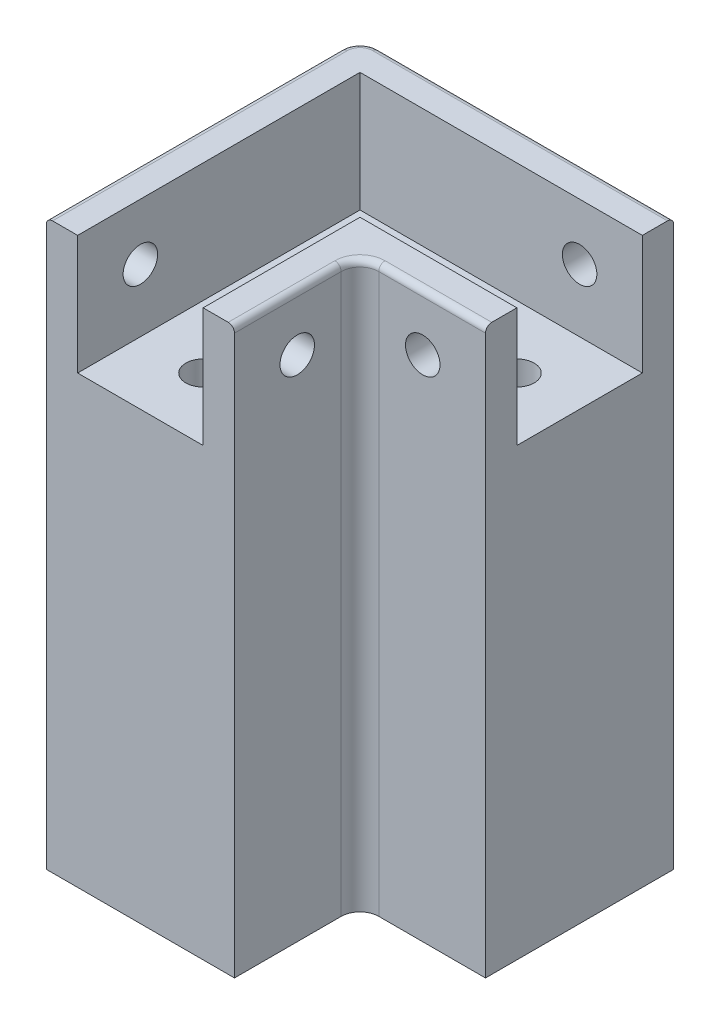
ISO-10303-21;
HEADER;
FILE_DESCRIPTION(('STEP AP214'),'2;1');
FILE_NAME('part.step','',(''),(''),'','','');
FILE_SCHEMA(('AUTOMOTIVE_DESIGN { 1 0 10303 214 1 1 1 1 }'));
ENDSEC;
DATA;
#1=APPLICATION_CONTEXT('core data for automotive mechanical design processes');
#2=APPLICATION_PROTOCOL_DEFINITION('international standard','automotive_design',2000,#1);
#3=PRODUCT_CONTEXT('',#1,'mechanical');
#4=PRODUCT('Part','Part','',(#3));
#5=PRODUCT_RELATED_PRODUCT_CATEGORY('part','',(#4));
#6=PRODUCT_DEFINITION_FORMATION('','',#4);
#7=PRODUCT_DEFINITION_CONTEXT('part definition',#1,'design');
#8=PRODUCT_DEFINITION('design','',#6,#7);
#9=PRODUCT_DEFINITION_SHAPE('','',#8);
#10=(LENGTH_UNIT() NAMED_UNIT(*) SI_UNIT(.MILLI.,.METRE.));
#11=(NAMED_UNIT(*) PLANE_ANGLE_UNIT() SI_UNIT($,.RADIAN.));
#12=(NAMED_UNIT(*) SI_UNIT($,.STERADIAN.) SOLID_ANGLE_UNIT());
#13=UNCERTAINTY_MEASURE_WITH_UNIT(LENGTH_MEASURE(1.E-05),#10,'distance_accuracy_value','');
#14=(GEOMETRIC_REPRESENTATION_CONTEXT(3) GLOBAL_UNCERTAINTY_ASSIGNED_CONTEXT((#13)) GLOBAL_UNIT_ASSIGNED_CONTEXT((#10,
#11,#12)) REPRESENTATION_CONTEXT('',''));
#15=CARTESIAN_POINT('',(0.,0.,0.));
#16=DIRECTION('',(0.,0.,1.));
#17=DIRECTION('',(1.,0.,0.));
#18=AXIS2_PLACEMENT_3D('',#15,#16,#17);
#19=CARTESIAN_POINT('',(0.,90.,0.));
#20=DIRECTION('',(0.,-1.,0.));
#21=DIRECTION('',(0.,0.,-1.));
#22=AXIS2_PLACEMENT_3D('',#19,#20,#21);
#23=PLANE('',#22);
#24=DIRECTION('',(0.,0.,-1.));
#25=VECTOR('',#24,1.);
#26=CARTESIAN_POINT('',(50.,90.,0.));
#27=LINE('',#26,#25);
#28=CARTESIAN_POINT('',(50.,90.,-45.));
#29=VERTEX_POINT('',#28);
#30=CARTESIAN_POINT('',(50.,90.,-49.));
#31=VERTEX_POINT('',#30);
#32=EDGE_CURVE('E343',#29,#31,#27,.T.);
#33=ORIENTED_EDGE('',*,*,#32,.T.);
#34=DIRECTION('',(-1.,0.,0.));
#35=VECTOR('',#34,1.);
#36=CARTESIAN_POINT('',(0.,90.,-49.));
#37=LINE('',#36,#35);
#38=CARTESIAN_POINT('',(3.,90.,-49.));
#39=VERTEX_POINT('',#38);
#40=EDGE_CURVE('E295',#31,#39,#37,.T.);
#41=ORIENTED_EDGE('',*,*,#40,.T.);
#42=CARTESIAN_POINT('',(3.,90.,-47.));
#43=DIRECTION('',(0.,-1.,0.));
#44=DIRECTION('',(0.,0.,-1.));
#45=AXIS2_PLACEMENT_3D('',#42,#43,#44);
#46=CIRCLE('',#45,2.);
#47=CARTESIAN_POINT('',(1.,90.,-47.));
#48=VERTEX_POINT('',#47);
#49=EDGE_CURVE('E292',#39,#48,#46,.F.);
#50=ORIENTED_EDGE('',*,*,#49,.T.);
#51=DIRECTION('',(0.,0.,1.));
#52=VECTOR('',#51,1.);
#53=CARTESIAN_POINT('',(1.,90.,0.));
#54=LINE('',#53,#52);
#55=CARTESIAN_POINT('',(0.999999999999999,90.,0.));
#56=VERTEX_POINT('',#55);
#57=EDGE_CURVE('E289',#48,#56,#54,.T.);
#58=ORIENTED_EDGE('',*,*,#57,.T.);
#59=DIRECTION('',(1.,0.,0.));
#60=VECTOR('',#59,1.);
#61=CARTESIAN_POINT('',(0.,90.,0.));
#62=LINE('',#61,#60);
#63=CARTESIAN_POINT('',(5.,90.,0.));
#64=VERTEX_POINT('',#63);
#65=EDGE_CURVE('E336',#56,#64,#62,.T.);
#66=ORIENTED_EDGE('',*,*,#65,.T.);
#67=DIRECTION('',(0.,0.,1.));
#68=VECTOR('',#67,1.);
#69=CARTESIAN_POINT('',(5.,90.,0.));
#70=LINE('',#69,#68);
#71=CARTESIAN_POINT('',(5.,90.,-45.));
#72=VERTEX_POINT('',#71);
#73=EDGE_CURVE('E395',#72,#64,#70,.T.);
#74=ORIENTED_EDGE('',*,*,#73,.F.);
#75=DIRECTION('',(-1.,0.,0.));
#76=VECTOR('',#75,1.);
#77=CARTESIAN_POINT('',(5.,90.,-45.));
#78=LINE('',#77,#76);
#79=EDGE_CURVE('E367',#29,#72,#78,.T.);
#80=ORIENTED_EDGE('',*,*,#79,.F.);
#81=EDGE_LOOP('',(#33,#41,#50,#58,#66,#74,#80));
#82=FACE_BOUND('',#81,.T.);
#83=ADVANCED_FACE('F45',(#82),#23,.F.);
#84=CARTESIAN_POINT('',(0.,90.,0.));
#85=DIRECTION('',(1.,0.,0.));
#86=DIRECTION('',(0.,0.,-1.));
#87=AXIS2_PLACEMENT_3D('',#84,#85,#86);
#88=PLANE('',#87);
#89=CARTESIAN_POINT('',(0.,81.,-10.));
#90=DIRECTION('',(-1.,0.,0.));
#91=DIRECTION('',(0.,0.,1.));
#92=AXIS2_PLACEMENT_3D('',#89,#90,#91);
#93=CIRCLE('',#92,2.75);
#94=CARTESIAN_POINT('',(0.,81.,-7.25));
#95=VERTEX_POINT('',#94);
#96=EDGE_CURVE('E245',#95,#95,#93,.T.);
#97=ORIENTED_EDGE('',*,*,#96,.F.);
#98=EDGE_LOOP('',(#97));
#99=FACE_BOUND('',#98,.T.);
#100=DIRECTION('',(0.,-1.,0.));
#101=VECTOR('',#100,1.);
#102=CARTESIAN_POINT('',(0.,90.,0.));
#103=LINE('',#102,#101);
#104=CARTESIAN_POINT('',(0.,89.,0.));
#105=VERTEX_POINT('',#104);
#106=CARTESIAN_POINT('',(0.,0.,0.));
#107=VERTEX_POINT('',#106);
#108=EDGE_CURVE('E221',#105,#107,#103,.T.);
#109=ORIENTED_EDGE('',*,*,#108,.F.);
#110=DIRECTION('',(0.,0.,1.));
#111=VECTOR('',#110,1.);
#112=CARTESIAN_POINT('',(0.,89.,0.));
#113=LINE('',#112,#111);
#114=CARTESIAN_POINT('',(0.,89.,-47.));
#115=VERTEX_POINT('',#114);
#116=EDGE_CURVE('E12',#105,#115,#113,.F.);
#117=ORIENTED_EDGE('',*,*,#116,.T.);
#118=DIRECTION('',(0.,-1.,0.));
#119=VECTOR('',#118,1.);
#120=CARTESIAN_POINT('',(0.,90.,-47.));
#121=LINE('',#120,#119);
#122=CARTESIAN_POINT('',(0.,0.,-47.));
#123=VERTEX_POINT('',#122);
#124=EDGE_CURVE('E256',#115,#123,#121,.T.);
#125=ORIENTED_EDGE('',*,*,#124,.T.);
#126=DIRECTION('',(0.,0.,1.));
#127=VECTOR('',#126,1.);
#128=CARTESIAN_POINT('',(0.,0.,0.));
#129=LINE('',#128,#127);
#130=EDGE_CURVE('E214',#123,#107,#129,.T.);
#131=ORIENTED_EDGE('',*,*,#130,.T.);
#132=EDGE_LOOP('',(#109,#117,#125,#131));
#133=FACE_BOUND('',#132,.T.);
#134=ADVANCED_FACE('F446',(#99,#133),#88,.F.);
#135=CARTESIAN_POINT('',(0.,90.,0.));
#136=DIRECTION('',(0.,0.,-1.));
#137=DIRECTION('',(-1.,0.,0.));
#138=AXIS2_PLACEMENT_3D('',#135,#136,#137);
#139=PLANE('',#138);
#140=DIRECTION('',(0.,1.,0.));
#141=VECTOR('',#140,1.);
#142=CARTESIAN_POINT('',(29.9967469095641,0.,0.));
#143=LINE('',#142,#141);
#144=CARTESIAN_POINT('',(29.9967469095641,0.,0.));
#145=VERTEX_POINT('',#144);
#146=CARTESIAN_POINT('',(29.9967469095641,89.,0.));
#147=VERTEX_POINT('',#146);
#148=EDGE_CURVE('E200',#145,#147,#143,.T.);
#149=ORIENTED_EDGE('',*,*,#148,.T.);
#150=CARTESIAN_POINT('',(28.9967469095641,89.,0.));
#151=DIRECTION('',(0.,0.,-1.));
#152=DIRECTION('',(-1.,0.,0.));
#153=AXIS2_PLACEMENT_3D('',#150,#151,#152);
#154=CIRCLE('',#153,1.);
#155=CARTESIAN_POINT('',(28.9967469095641,90.,0.));
#156=VERTEX_POINT('',#155);
#157=EDGE_CURVE('E55',#147,#156,#154,.F.);
#158=ORIENTED_EDGE('',*,*,#157,.T.);
#159=CARTESIAN_POINT('',(25.,90.,0.));
#160=VERTEX_POINT('',#159);
#161=EDGE_CURVE('E211',#160,#156,#62,.T.);
#162=ORIENTED_EDGE('',*,*,#161,.F.);
#163=DIRECTION('',(0.,1.,0.));
#164=VECTOR('',#163,1.);
#165=CARTESIAN_POINT('',(25.,71.,0.));
#166=LINE('',#165,#164);
#167=CARTESIAN_POINT('',(25.,71.,0.));
#168=VERTEX_POINT('',#167);
#169=EDGE_CURVE('E375',#168,#160,#166,.T.);
#170=ORIENTED_EDGE('',*,*,#169,.F.);
#171=DIRECTION('',(1.,0.,0.));
#172=VECTOR('',#171,1.);
#173=CARTESIAN_POINT('',(5.,71.,0.));
#174=LINE('',#173,#172);
#175=CARTESIAN_POINT('',(5.,71.,0.));
#176=VERTEX_POINT('',#175);
#177=EDGE_CURVE('E410',#176,#168,#174,.T.);
#178=ORIENTED_EDGE('',*,*,#177,.F.);
#179=DIRECTION('',(0.,1.,0.));
#180=VECTOR('',#179,1.);
#181=CARTESIAN_POINT('',(5.,71.,0.));
#182=LINE('',#181,#180);
#183=EDGE_CURVE('E341',#176,#64,#182,.T.);
#184=ORIENTED_EDGE('',*,*,#183,.T.);
#185=ORIENTED_EDGE('',*,*,#65,.F.);
#186=CARTESIAN_POINT('',(1.,89.,0.));
#187=DIRECTION('',(0.,0.,-1.));
#188=DIRECTION('',(-1.,0.,0.));
#189=AXIS2_PLACEMENT_3D('',#186,#187,#188);
#190=CIRCLE('',#189,1.);
#191=EDGE_CURVE('E63',#56,#105,#190,.F.);
#192=ORIENTED_EDGE('',*,*,#191,.T.);
#193=ORIENTED_EDGE('',*,*,#108,.T.);
#194=DIRECTION('',(1.,0.,0.));
#195=VECTOR('',#194,1.);
#196=CARTESIAN_POINT('',(0.,0.,0.));
#197=LINE('',#196,#195);
#198=EDGE_CURVE('E207',#107,#145,#197,.T.);
#199=ORIENTED_EDGE('',*,*,#198,.T.);
#200=EDGE_LOOP('',(#149,#158,#162,#170,#178,#184,#185,#192,#193,#199));
#201=FACE_BOUND('',#200,.T.);
#202=ADVANCED_FACE('F339',(#201),#139,.F.);
#203=CARTESIAN_POINT('',(50.,90.,0.));
#204=DIRECTION('',(-1.,0.,0.));
#205=DIRECTION('',(0.,0.,1.));
#206=AXIS2_PLACEMENT_3D('',#203,#204,#205);
#207=PLANE('',#206);
#208=CARTESIAN_POINT('',(50.,90.,-21.));
#209=VERTEX_POINT('',#208);
#210=CARTESIAN_POINT('',(50.,90.,-25.));
#211=VERTEX_POINT('',#210);
#212=EDGE_CURVE('E222',#209,#211,#27,.T.);
#213=ORIENTED_EDGE('',*,*,#212,.F.);
#214=CARTESIAN_POINT('',(50.,89.,-21.));
#215=DIRECTION('',(-1.,0.,0.));
#216=DIRECTION('',(0.,0.,1.));
#217=AXIS2_PLACEMENT_3D('',#214,#215,#216);
#218=CIRCLE('',#217,1.);
#219=CARTESIAN_POINT('',(50.,89.,-20.));
#220=VERTEX_POINT('',#219);
#221=EDGE_CURVE('E198',#209,#220,#218,.F.);
#222=ORIENTED_EDGE('',*,*,#221,.T.);
#223=DIRECTION('',(0.,1.,0.));
#224=VECTOR('',#223,1.);
#225=CARTESIAN_POINT('',(50.,0.,-20.));
#226=LINE('',#225,#224);
#227=CARTESIAN_POINT('',(50.,0.,-20.));
#228=VERTEX_POINT('',#227);
#229=EDGE_CURVE('E179',#228,#220,#226,.T.);
#230=ORIENTED_EDGE('',*,*,#229,.F.);
#231=DIRECTION('',(0.,0.,-1.));
#232=VECTOR('',#231,1.);
#233=CARTESIAN_POINT('',(50.,0.,0.));
#234=LINE('',#233,#232);
#235=CARTESIAN_POINT('',(50.,0.,-50.));
#236=VERTEX_POINT('',#235);
#237=EDGE_CURVE('E195',#228,#236,#234,.T.);
#238=ORIENTED_EDGE('',*,*,#237,.T.);
#239=DIRECTION('',(0.,-1.,0.));
#240=VECTOR('',#239,1.);
#241=CARTESIAN_POINT('',(50.,90.,-50.));
#242=LINE('',#241,#240);
#243=CARTESIAN_POINT('',(50.,89.,-50.));
#244=VERTEX_POINT('',#243);
#245=EDGE_CURVE('E218',#244,#236,#242,.T.);
#246=ORIENTED_EDGE('',*,*,#245,.F.);
#247=CARTESIAN_POINT('',(50.,89.,-49.));
#248=DIRECTION('',(-1.,0.,0.));
#249=DIRECTION('',(0.,0.,1.));
#250=AXIS2_PLACEMENT_3D('',#247,#248,#249);
#251=CIRCLE('',#250,1.);
#252=EDGE_CURVE('E281',#244,#31,#251,.F.);
#253=ORIENTED_EDGE('',*,*,#252,.T.);
#254=ORIENTED_EDGE('',*,*,#32,.F.);
#255=DIRECTION('',(0.,1.,0.));
#256=VECTOR('',#255,1.);
#257=CARTESIAN_POINT('',(50.,71.,-45.));
#258=LINE('',#257,#256);
#259=CARTESIAN_POINT('',(50.,71.,-45.));
#260=VERTEX_POINT('',#259);
#261=EDGE_CURVE('E358',#260,#29,#258,.T.);
#262=ORIENTED_EDGE('',*,*,#261,.F.);
#263=DIRECTION('',(0.,0.,-1.));
#264=VECTOR('',#263,1.);
#265=CARTESIAN_POINT('',(50.,71.,-45.));
#266=LINE('',#265,#264);
#267=CARTESIAN_POINT('',(50.,71.,-25.));
#268=VERTEX_POINT('',#267);
#269=EDGE_CURVE('E385',#268,#260,#266,.T.);
#270=ORIENTED_EDGE('',*,*,#269,.F.);
#271=DIRECTION('',(0.,1.,0.));
#272=VECTOR('',#271,1.);
#273=CARTESIAN_POINT('',(50.,71.,-25.));
#274=LINE('',#273,#272);
#275=EDGE_CURVE('E364',#268,#211,#274,.T.);
#276=ORIENTED_EDGE('',*,*,#275,.T.);
#277=EDGE_LOOP('',(#213,#222,#230,#238,#246,#253,#254,#262,#270,#276));
#278=FACE_BOUND('',#277,.T.);
#279=ADVANCED_FACE('F193',(#278),#207,.F.);
#280=CARTESIAN_POINT('',(0.,90.,-50.));
#281=DIRECTION('',(0.,0.,1.));
#282=DIRECTION('',(1.,0.,0.));
#283=AXIS2_PLACEMENT_3D('',#280,#281,#282);
#284=PLANE('',#283);
#285=CARTESIAN_POINT('',(40.,81.,-50.));
#286=DIRECTION('',(0.,0.,-1.));
#287=DIRECTION('',(-1.,0.,0.));
#288=AXIS2_PLACEMENT_3D('',#285,#286,#287);
#289=CIRCLE('',#288,2.75);
#290=CARTESIAN_POINT('',(37.25,81.,-50.));
#291=VERTEX_POINT('',#290);
#292=EDGE_CURVE('E251',#291,#291,#289,.T.);
#293=ORIENTED_EDGE('',*,*,#292,.F.);
#294=EDGE_LOOP('',(#293));
#295=FACE_BOUND('',#294,.T.);
#296=DIRECTION('',(0.,-1.,0.));
#297=VECTOR('',#296,1.);
#298=CARTESIAN_POINT('',(3.,90.,-50.));
#299=LINE('',#298,#297);
#300=CARTESIAN_POINT('',(3.,0.,-50.));
#301=VERTEX_POINT('',#300);
#302=CARTESIAN_POINT('',(3.,89.,-50.));
#303=VERTEX_POINT('',#302);
#304=EDGE_CURVE('E262',#301,#303,#299,.F.);
#305=ORIENTED_EDGE('',*,*,#304,.T.);
#306=DIRECTION('',(-1.,0.,0.));
#307=VECTOR('',#306,1.);
#308=CARTESIAN_POINT('',(0.,89.,-50.));
#309=LINE('',#308,#307);
#310=EDGE_CURVE('E299',#303,#244,#309,.F.);
#311=ORIENTED_EDGE('',*,*,#310,.T.);
#312=ORIENTED_EDGE('',*,*,#245,.T.);
#313=DIRECTION('',(-1.,0.,0.));
#314=VECTOR('',#313,1.);
#315=CARTESIAN_POINT('',(0.,0.,-50.));
#316=LINE('',#315,#314);
#317=EDGE_CURVE('E205',#236,#301,#316,.T.);
#318=ORIENTED_EDGE('',*,*,#317,.T.);
#319=EDGE_LOOP('',(#305,#311,#312,#318));
#320=FACE_BOUND('',#319,.T.);
#321=ADVANCED_FACE('F453',(#295,#320),#284,.F.);
#322=CARTESIAN_POINT('',(32.9967469095641,90.,-17.));
#323=DIRECTION('',(0.,-1.,0.));
#324=DIRECTION('',(0.,0.,-1.));
#325=AXIS2_PLACEMENT_3D('',#322,#323,#324);
#326=CIRCLE('',#325,4.);
#327=CARTESIAN_POINT('',(28.9967469095641,90.,-17.));
#328=VERTEX_POINT('',#327);
#329=CARTESIAN_POINT('',(32.9967469095641,90.,-21.));
#330=VERTEX_POINT('',#329);
#331=EDGE_CURVE('E275',#328,#330,#326,.T.);
#332=ORIENTED_EDGE('',*,*,#331,.T.);
#333=DIRECTION('',(-1.,0.,0.));
#334=VECTOR('',#333,1.);
#335=CARTESIAN_POINT('',(0.,90.,-21.));
#336=LINE('',#335,#334);
#337=EDGE_CURVE('E278',#330,#209,#336,.F.);
#338=ORIENTED_EDGE('',*,*,#337,.T.);
#339=ORIENTED_EDGE('',*,*,#212,.T.);
#340=DIRECTION('',(1.,0.,0.));
#341=VECTOR('',#340,1.);
#342=CARTESIAN_POINT('',(25.,90.,-25.));
#343=LINE('',#342,#341);
#344=CARTESIAN_POINT('',(25.,90.,-25.));
#345=VERTEX_POINT('',#344);
#346=EDGE_CURVE('E400',#345,#211,#343,.T.);
#347=ORIENTED_EDGE('',*,*,#346,.F.);
#348=DIRECTION('',(0.,0.,-1.));
#349=VECTOR('',#348,1.);
#350=CARTESIAN_POINT('',(25.,90.,0.));
#351=LINE('',#350,#349);
#352=EDGE_CURVE('E398',#160,#345,#351,.T.);
#353=ORIENTED_EDGE('',*,*,#352,.F.);
#354=ORIENTED_EDGE('',*,*,#161,.T.);
#355=DIRECTION('',(0.,0.,1.));
#356=VECTOR('',#355,1.);
#357=CARTESIAN_POINT('',(28.9967469095641,90.,0.));
#358=LINE('',#357,#356);
#359=EDGE_CURVE('E272',#156,#328,#358,.F.);
#360=ORIENTED_EDGE('',*,*,#359,.T.);
#361=EDGE_LOOP('',(#332,#338,#339,#347,#353,#354,#360));
#362=FACE_BOUND('',#361,.T.);
#363=ADVANCED_FACE('F439',(#362),#23,.F.);
#364=CARTESIAN_POINT('',(0.,0.,0.));
#365=DIRECTION('',(0.,-1.,0.));
#366=DIRECTION('',(0.,0.,-1.));
#367=AXIS2_PLACEMENT_3D('',#364,#365,#366);
#368=PLANE('',#367);
#369=CARTESIAN_POINT('',(14.998373454782,0.,-10.));
#370=DIRECTION('',(0.,-1.,0.));
#371=DIRECTION('',(0.,0.,-1.));
#372=AXIS2_PLACEMENT_3D('',#369,#370,#371);
#373=CIRCLE('',#372,6.);
#374=CARTESIAN_POINT('',(14.998373454782,0.,-16.));
#375=VERTEX_POINT('',#374);
#376=EDGE_CURVE('E759',#375,#375,#373,.T.);
#377=ORIENTED_EDGE('',*,*,#376,.F.);
#378=EDGE_LOOP('',(#377));
#379=FACE_BOUND('',#378,.T.);
#380=CARTESIAN_POINT('',(40.,0.,-35.));
#381=DIRECTION('',(0.,-1.,0.));
#382=DIRECTION('',(0.,0.,-1.));
#383=AXIS2_PLACEMENT_3D('',#380,#381,#382);
#384=CIRCLE('',#383,6.);
#385=CARTESIAN_POINT('',(40.,0.,-41.));
#386=VERTEX_POINT('',#385);
#387=EDGE_CURVE('E767',#386,#386,#384,.T.);
#388=ORIENTED_EDGE('',*,*,#387,.F.);
#389=EDGE_LOOP('',(#388));
#390=FACE_BOUND('',#389,.T.);
#391=CARTESIAN_POINT('',(14.9983734547821,0.,-35.));
#392=DIRECTION('',(0.,-1.,0.));
#393=DIRECTION('',(0.,0.,-1.));
#394=AXIS2_PLACEMENT_3D('',#391,#392,#393);
#395=CIRCLE('',#394,6.);
#396=CARTESIAN_POINT('',(14.9983734547821,0.,-41.));
#397=VERTEX_POINT('',#396);
#398=EDGE_CURVE('E239',#397,#397,#395,.T.);
#399=ORIENTED_EDGE('',*,*,#398,.F.);
#400=EDGE_LOOP('',(#399));
#401=FACE_BOUND('',#400,.T.);
#402=ORIENTED_EDGE('',*,*,#130,.F.);
#403=CARTESIAN_POINT('',(3.,0.,-47.));
#404=DIRECTION('',(0.,-1.,0.));
#405=DIRECTION('',(0.,0.,-1.));
#406=AXIS2_PLACEMENT_3D('',#403,#404,#405);
#407=CIRCLE('',#406,3.);
#408=EDGE_CURVE('E259',#123,#301,#407,.T.);
#409=ORIENTED_EDGE('',*,*,#408,.T.);
#410=ORIENTED_EDGE('',*,*,#317,.F.);
#411=ORIENTED_EDGE('',*,*,#237,.F.);
#412=DIRECTION('',(-1.,0.,0.));
#413=VECTOR('',#412,1.);
#414=CARTESIAN_POINT('',(50.,0.,-20.));
#415=LINE('',#414,#413);
#416=CARTESIAN_POINT('',(32.9967469095641,0.,-20.));
#417=VERTEX_POINT('',#416);
#418=EDGE_CURVE('E175',#228,#417,#415,.T.);
#419=ORIENTED_EDGE('',*,*,#418,.T.);
#420=CARTESIAN_POINT('',(32.9967469095641,0.,-17.));
#421=DIRECTION('',(0.,-1.,0.));
#422=DIRECTION('',(0.,0.,-1.));
#423=AXIS2_PLACEMENT_3D('',#420,#421,#422);
#424=CIRCLE('',#423,3.);
#425=CARTESIAN_POINT('',(29.9967469095641,0.,-17.));
#426=VERTEX_POINT('',#425);
#427=EDGE_CURVE('E266',#417,#426,#424,.F.);
#428=ORIENTED_EDGE('',*,*,#427,.T.);
#429=DIRECTION('',(0.,0.,1.));
#430=VECTOR('',#429,1.);
#431=CARTESIAN_POINT('',(29.9967469095641,0.,0.));
#432=LINE('',#431,#430);
#433=EDGE_CURVE('E187',#426,#145,#432,.T.);
#434=ORIENTED_EDGE('',*,*,#433,.T.);
#435=ORIENTED_EDGE('',*,*,#198,.F.);
#436=EDGE_LOOP('',(#402,#409,#410,#411,#419,#428,#434,#435));
#437=FACE_BOUND('',#436,.T.);
#438=ADVANCED_FACE('F203',(#379,#390,#401,#437),#368,.T.);
#439=CARTESIAN_POINT('',(5.,71.,0.));
#440=DIRECTION('',(-1.,0.,0.));
#441=DIRECTION('',(0.,0.,1.));
#442=AXIS2_PLACEMENT_3D('',#439,#440,#441);
#443=PLANE('',#442);
#444=CARTESIAN_POINT('',(5.,81.,-10.));
#445=DIRECTION('',(-1.,0.,0.));
#446=DIRECTION('',(0.,0.,1.));
#447=AXIS2_PLACEMENT_3D('',#444,#445,#446);
#448=CIRCLE('',#447,2.75);
#449=CARTESIAN_POINT('',(5.,81.,-7.25));
#450=VERTEX_POINT('',#449);
#451=EDGE_CURVE('E741',#450,#450,#448,.T.);
#452=ORIENTED_EDGE('',*,*,#451,.T.);
#453=EDGE_LOOP('',(#452));
#454=FACE_BOUND('',#453,.T.);
#455=ORIENTED_EDGE('',*,*,#73,.T.);
#456=ORIENTED_EDGE('',*,*,#183,.F.);
#457=DIRECTION('',(0.,0.,1.));
#458=VECTOR('',#457,1.);
#459=CARTESIAN_POINT('',(5.,71.,0.));
#460=LINE('',#459,#458);
#461=CARTESIAN_POINT('',(5.,71.,-45.));
#462=VERTEX_POINT('',#461);
#463=EDGE_CURVE('E406',#462,#176,#460,.T.);
#464=ORIENTED_EDGE('',*,*,#463,.F.);
#465=DIRECTION('',(0.,1.,0.));
#466=VECTOR('',#465,1.);
#467=CARTESIAN_POINT('',(5.,71.,-45.));
#468=LINE('',#467,#466);
#469=EDGE_CURVE('E354',#462,#72,#468,.T.);
#470=ORIENTED_EDGE('',*,*,#469,.T.);
#471=EDGE_LOOP('',(#455,#456,#464,#470));
#472=FACE_BOUND('',#471,.T.);
#473=ADVANCED_FACE('F428',(#454,#472),#443,.F.);
#474=CARTESIAN_POINT('',(5.,71.,-45.));
#475=DIRECTION('',(0.,0.,-1.));
#476=DIRECTION('',(-1.,0.,0.));
#477=AXIS2_PLACEMENT_3D('',#474,#475,#476);
#478=PLANE('',#477);
#479=CARTESIAN_POINT('',(40.,81.,-45.));
#480=DIRECTION('',(0.,0.,-1.));
#481=DIRECTION('',(-1.,0.,0.));
#482=AXIS2_PLACEMENT_3D('',#479,#480,#481);
#483=CIRCLE('',#482,2.75);
#484=CARTESIAN_POINT('',(37.25,81.,-45.));
#485=VERTEX_POINT('',#484);
#486=EDGE_CURVE('E804',#485,#485,#483,.T.);
#487=ORIENTED_EDGE('',*,*,#486,.T.);
#488=EDGE_LOOP('',(#487));
#489=FACE_BOUND('',#488,.T.);
#490=ORIENTED_EDGE('',*,*,#79,.T.);
#491=ORIENTED_EDGE('',*,*,#469,.F.);
#492=DIRECTION('',(-1.,0.,0.));
#493=VECTOR('',#492,1.);
#494=CARTESIAN_POINT('',(5.,71.,-45.));
#495=LINE('',#494,#493);
#496=EDGE_CURVE('E382',#260,#462,#495,.T.);
#497=ORIENTED_EDGE('',*,*,#496,.F.);
#498=ORIENTED_EDGE('',*,*,#261,.T.);
#499=EDGE_LOOP('',(#490,#491,#497,#498));
#500=FACE_BOUND('',#499,.T.);
#501=ADVANCED_FACE('F427',(#489,#500),#478,.F.);
#502=CARTESIAN_POINT('',(25.,71.,-25.));
#503=DIRECTION('',(0.,0.,1.));
#504=DIRECTION('',(1.,0.,0.));
#505=AXIS2_PLACEMENT_3D('',#502,#503,#504);
#506=PLANE('',#505);
#507=CARTESIAN_POINT('',(40.,81.,-25.));
#508=DIRECTION('',(0.,0.,1.));
#509=DIRECTION('',(1.,0.,0.));
#510=AXIS2_PLACEMENT_3D('',#507,#508,#509);
#511=CIRCLE('',#510,2.75);
#512=CARTESIAN_POINT('',(42.75,81.,-25.));
#513=VERTEX_POINT('',#512);
#514=EDGE_CURVE('E250',#513,#513,#511,.T.);
#515=ORIENTED_EDGE('',*,*,#514,.T.);
#516=EDGE_LOOP('',(#515));
#517=FACE_BOUND('',#516,.T.);
#518=ORIENTED_EDGE('',*,*,#346,.T.);
#519=ORIENTED_EDGE('',*,*,#275,.F.);
#520=DIRECTION('',(1.,0.,0.));
#521=VECTOR('',#520,1.);
#522=CARTESIAN_POINT('',(25.,71.,-25.));
#523=LINE('',#522,#521);
#524=CARTESIAN_POINT('',(25.,71.,-25.));
#525=VERTEX_POINT('',#524);
#526=EDGE_CURVE('E391',#525,#268,#523,.T.);
#527=ORIENTED_EDGE('',*,*,#526,.F.);
#528=DIRECTION('',(0.,1.,0.));
#529=VECTOR('',#528,1.);
#530=CARTESIAN_POINT('',(25.,71.,-25.));
#531=LINE('',#530,#529);
#532=EDGE_CURVE('E373',#525,#345,#531,.T.);
#533=ORIENTED_EDGE('',*,*,#532,.T.);
#534=EDGE_LOOP('',(#518,#519,#527,#533));
#535=FACE_BOUND('',#534,.T.);
#536=ADVANCED_FACE('F436',(#517,#535),#506,.F.);
#537=CARTESIAN_POINT('',(25.,71.,0.));
#538=DIRECTION('',(1.,0.,0.));
#539=DIRECTION('',(0.,0.,-1.));
#540=AXIS2_PLACEMENT_3D('',#537,#538,#539);
#541=PLANE('',#540);
#542=CARTESIAN_POINT('',(25.,81.,-10.));
#543=DIRECTION('',(1.,0.,0.));
#544=DIRECTION('',(0.,0.,-1.));
#545=AXIS2_PLACEMENT_3D('',#542,#543,#544);
#546=CIRCLE('',#545,2.75);
#547=CARTESIAN_POINT('',(25.,81.,-7.25));
#548=VERTEX_POINT('',#547);
#549=EDGE_CURVE('E244',#548,#548,#546,.T.);
#550=ORIENTED_EDGE('',*,*,#549,.T.);
#551=EDGE_LOOP('',(#550));
#552=FACE_BOUND('',#551,.T.);
#553=ORIENTED_EDGE('',*,*,#352,.T.);
#554=ORIENTED_EDGE('',*,*,#532,.F.);
#555=DIRECTION('',(0.,0.,-1.));
#556=VECTOR('',#555,1.);
#557=CARTESIAN_POINT('',(25.,71.,0.));
#558=LINE('',#557,#556);
#559=EDGE_CURVE('E414',#168,#525,#558,.T.);
#560=ORIENTED_EDGE('',*,*,#559,.F.);
#561=ORIENTED_EDGE('',*,*,#169,.T.);
#562=EDGE_LOOP('',(#553,#554,#560,#561));
#563=FACE_BOUND('',#562,.T.);
#564=ADVANCED_FACE('F729',(#552,#563),#541,.F.);
#565=CARTESIAN_POINT('',(0.,71.,0.));
#566=DIRECTION('',(0.,-1.,0.));
#567=DIRECTION('',(0.,0.,-1.));
#568=AXIS2_PLACEMENT_3D('',#565,#566,#567);
#569=PLANE('',#568);
#570=CARTESIAN_POINT('',(14.998373454782,71.,-10.));
#571=DIRECTION('',(0.,-1.,0.));
#572=DIRECTION('',(0.,0.,-1.));
#573=AXIS2_PLACEMENT_3D('',#570,#571,#572);
#574=CIRCLE('',#573,2.75);
#575=CARTESIAN_POINT('',(14.998373454782,71.,-12.75));
#576=VERTEX_POINT('',#575);
#577=EDGE_CURVE('E235',#576,#576,#574,.T.);
#578=ORIENTED_EDGE('',*,*,#577,.T.);
#579=EDGE_LOOP('',(#578));
#580=FACE_BOUND('',#579,.T.);
#581=CARTESIAN_POINT('',(40.,71.,-35.));
#582=DIRECTION('',(0.,-1.,0.));
#583=DIRECTION('',(0.,0.,-1.));
#584=AXIS2_PLACEMENT_3D('',#581,#582,#583);
#585=CIRCLE('',#584,2.75);
#586=CARTESIAN_POINT('',(40.,71.,-37.75));
#587=VERTEX_POINT('',#586);
#588=EDGE_CURVE('E230',#587,#587,#585,.T.);
#589=ORIENTED_EDGE('',*,*,#588,.T.);
#590=EDGE_LOOP('',(#589));
#591=FACE_BOUND('',#590,.T.);
#592=CARTESIAN_POINT('',(14.9983734547821,71.,-35.));
#593=DIRECTION('',(0.,-1.,0.));
#594=DIRECTION('',(0.,0.,-1.));
#595=AXIS2_PLACEMENT_3D('',#592,#593,#594);
#596=CIRCLE('',#595,2.75);
#597=CARTESIAN_POINT('',(14.9983734547821,71.,-37.75));
#598=VERTEX_POINT('',#597);
#599=EDGE_CURVE('E226',#598,#598,#596,.T.);
#600=ORIENTED_EDGE('',*,*,#599,.T.);
#601=EDGE_LOOP('',(#600));
#602=FACE_BOUND('',#601,.T.);
#603=ORIENTED_EDGE('',*,*,#463,.T.);
#604=ORIENTED_EDGE('',*,*,#177,.T.);
#605=ORIENTED_EDGE('',*,*,#559,.T.);
#606=ORIENTED_EDGE('',*,*,#526,.T.);
#607=ORIENTED_EDGE('',*,*,#269,.T.);
#608=ORIENTED_EDGE('',*,*,#496,.T.);
#609=EDGE_LOOP('',(#603,#604,#605,#606,#607,#608));
#610=FACE_BOUND('',#609,.T.);
#611=ADVANCED_FACE('F424',(#580,#591,#602,#610),#569,.F.);
#612=CARTESIAN_POINT('',(29.9967469095641,0.,0.));
#613=DIRECTION('',(-1.,0.,0.));
#614=DIRECTION('',(0.,0.,1.));
#615=AXIS2_PLACEMENT_3D('',#612,#613,#614);
#616=PLANE('',#615);
#617=CARTESIAN_POINT('',(29.9967469095641,81.,-10.));
#618=DIRECTION('',(-1.,0.,0.));
#619=DIRECTION('',(0.,0.,1.));
#620=AXIS2_PLACEMENT_3D('',#617,#618,#619);
#621=CIRCLE('',#620,2.75);
#622=CARTESIAN_POINT('',(29.9967469095641,81.,-7.25));
#623=VERTEX_POINT('',#622);
#624=EDGE_CURVE('E240',#623,#623,#621,.T.);
#625=ORIENTED_EDGE('',*,*,#624,.T.);
#626=EDGE_LOOP('',(#625));
#627=FACE_BOUND('',#626,.T.);
#628=DIRECTION('',(0.,1.,0.));
#629=VECTOR('',#628,1.);
#630=CARTESIAN_POINT('',(29.9967469095641,90.,-17.));
#631=LINE('',#630,#629);
#632=CARTESIAN_POINT('',(29.9967469095641,89.,-17.));
#633=VERTEX_POINT('',#632);
#634=EDGE_CURVE('E225',#426,#633,#631,.T.);
#635=ORIENTED_EDGE('',*,*,#634,.T.);
#636=DIRECTION('',(0.,0.,1.));
#637=VECTOR('',#636,1.);
#638=CARTESIAN_POINT('',(29.9967469095641,89.,0.));
#639=LINE('',#638,#637);
#640=EDGE_CURVE('E71',#633,#147,#639,.T.);
#641=ORIENTED_EDGE('',*,*,#640,.T.);
#642=ORIENTED_EDGE('',*,*,#148,.F.);
#643=ORIENTED_EDGE('',*,*,#433,.F.);
#644=EDGE_LOOP('',(#635,#641,#642,#643));
#645=FACE_BOUND('',#644,.T.);
#646=ADVANCED_FACE('F474',(#627,#645),#616,.F.);
#647=CARTESIAN_POINT('',(50.,0.,-20.));
#648=DIRECTION('',(0.,0.,-1.));
#649=DIRECTION('',(-1.,0.,0.));
#650=AXIS2_PLACEMENT_3D('',#647,#648,#649);
#651=PLANE('',#650);
#652=CARTESIAN_POINT('',(40.,81.,-20.));
#653=DIRECTION('',(0.,0.,-1.));
#654=DIRECTION('',(-1.,0.,0.));
#655=AXIS2_PLACEMENT_3D('',#652,#653,#654);
#656=CIRCLE('',#655,2.75);
#657=CARTESIAN_POINT('',(37.25,81.,-20.));
#658=VERTEX_POINT('',#657);
#659=EDGE_CURVE('E246',#658,#658,#656,.T.);
#660=ORIENTED_EDGE('',*,*,#659,.T.);
#661=EDGE_LOOP('',(#660));
#662=FACE_BOUND('',#661,.T.);
#663=ORIENTED_EDGE('',*,*,#229,.T.);
#664=DIRECTION('',(-1.,0.,0.));
#665=VECTOR('',#664,1.);
#666=CARTESIAN_POINT('',(50.,89.,-20.));
#667=LINE('',#666,#665);
#668=CARTESIAN_POINT('',(32.9967469095641,89.,-20.));
#669=VERTEX_POINT('',#668);
#670=EDGE_CURVE('E269',#220,#669,#667,.T.);
#671=ORIENTED_EDGE('',*,*,#670,.T.);
#672=DIRECTION('',(0.,1.,0.));
#673=VECTOR('',#672,1.);
#674=CARTESIAN_POINT('',(32.9967469095641,0.,-20.));
#675=LINE('',#674,#673);
#676=EDGE_CURVE('E182',#669,#417,#675,.F.);
#677=ORIENTED_EDGE('',*,*,#676,.T.);
#678=ORIENTED_EDGE('',*,*,#418,.F.);
#679=EDGE_LOOP('',(#663,#671,#677,#678));
#680=FACE_BOUND('',#679,.T.);
#681=ADVANCED_FACE('F177',(#662,#680),#651,.F.);
#682=CARTESIAN_POINT('',(14.9983734547821,87.9705627484772,-35.));
#683=DIRECTION('',(0.,-1.,0.));
#684=DIRECTION('',(0.,0.,-1.));
#685=AXIS2_PLACEMENT_3D('',#682,#683,#684);
#686=CYLINDRICAL_SURFACE('',#685,6.);
#687=CARTESIAN_POINT('',(14.9983734547821,66.,-35.));
#688=DIRECTION('',(0.,-1.,0.));
#689=DIRECTION('',(0.,0.,-1.));
#690=AXIS2_PLACEMENT_3D('',#687,#688,#689);
#691=CIRCLE('',#690,6.);
#692=CARTESIAN_POINT('',(14.9983734547821,66.,-41.));
#693=VERTEX_POINT('',#692);
#694=EDGE_CURVE('E771',#693,#693,#691,.F.);
#695=ORIENTED_EDGE('',*,*,#694,.T.);
#696=EDGE_LOOP('',(#695));
#697=FACE_BOUND('',#696,.T.);
#698=ORIENTED_EDGE('',*,*,#398,.T.);
#699=EDGE_LOOP('',(#698));
#700=FACE_BOUND('',#699,.T.);
#701=ADVANCED_FACE('F546',(#697,#700),#686,.F.);
#702=CARTESIAN_POINT('',(0.,66.,0.));
#703=DIRECTION('',(0.,-1.,0.));
#704=DIRECTION('',(0.,0.,-1.));
#705=AXIS2_PLACEMENT_3D('',#702,#703,#704);
#706=PLANE('',#705);
#707=CARTESIAN_POINT('',(14.9983734547821,66.,-35.));
#708=DIRECTION('',(0.,-1.,0.));
#709=DIRECTION('',(0.,0.,-1.));
#710=AXIS2_PLACEMENT_3D('',#707,#708,#709);
#711=CIRCLE('',#710,2.75);
#712=CARTESIAN_POINT('',(14.9983734547821,66.,-37.75));
#713=VERTEX_POINT('',#712);
#714=EDGE_CURVE('E744',#713,#713,#711,.T.);
#715=ORIENTED_EDGE('',*,*,#714,.F.);
#716=EDGE_LOOP('',(#715));
#717=FACE_BOUND('',#716,.T.);
#718=ORIENTED_EDGE('',*,*,#694,.F.);
#719=EDGE_LOOP('',(#718));
#720=FACE_BOUND('',#719,.T.);
#721=ADVANCED_FACE('F685',(#717,#720),#706,.T.);
#722=CARTESIAN_POINT('',(40.,87.9705627484772,-35.));
#723=DIRECTION('',(0.,-1.,0.));
#724=DIRECTION('',(0.,0.,-1.));
#725=AXIS2_PLACEMENT_3D('',#722,#723,#724);
#726=CYLINDRICAL_SURFACE('',#725,6.);
#727=CARTESIAN_POINT('',(40.,66.,-35.));
#728=DIRECTION('',(0.,-1.,0.));
#729=DIRECTION('',(0.,0.,-1.));
#730=AXIS2_PLACEMENT_3D('',#727,#728,#729);
#731=CIRCLE('',#730,6.);
#732=CARTESIAN_POINT('',(40.,66.,-41.));
#733=VERTEX_POINT('',#732);
#734=EDGE_CURVE('E763',#733,#733,#731,.F.);
#735=ORIENTED_EDGE('',*,*,#734,.T.);
#736=EDGE_LOOP('',(#735));
#737=FACE_BOUND('',#736,.T.);
#738=ORIENTED_EDGE('',*,*,#387,.T.);
#739=EDGE_LOOP('',(#738));
#740=FACE_BOUND('',#739,.T.);
#741=ADVANCED_FACE('F677',(#737,#740),#726,.F.);
#742=CARTESIAN_POINT('',(0.,66.,0.));
#743=DIRECTION('',(0.,-1.,0.));
#744=DIRECTION('',(0.,0.,-1.));
#745=AXIS2_PLACEMENT_3D('',#742,#743,#744);
#746=PLANE('',#745);
#747=CARTESIAN_POINT('',(40.,66.,-35.));
#748=DIRECTION('',(0.,-1.,0.));
#749=DIRECTION('',(0.,0.,-1.));
#750=AXIS2_PLACEMENT_3D('',#747,#748,#749);
#751=CIRCLE('',#750,2.75);
#752=CARTESIAN_POINT('',(40.,66.,-37.75));
#753=VERTEX_POINT('',#752);
#754=EDGE_CURVE('E752',#753,#753,#751,.T.);
#755=ORIENTED_EDGE('',*,*,#754,.F.);
#756=EDGE_LOOP('',(#755));
#757=FACE_BOUND('',#756,.T.);
#758=ORIENTED_EDGE('',*,*,#734,.F.);
#759=EDGE_LOOP('',(#758));
#760=FACE_BOUND('',#759,.T.);
#761=ADVANCED_FACE('F668',(#757,#760),#746,.T.);
#762=CARTESIAN_POINT('',(14.998373454782,87.9705627484772,-10.));
#763=DIRECTION('',(0.,-1.,0.));
#764=DIRECTION('',(0.,0.,-1.));
#765=AXIS2_PLACEMENT_3D('',#762,#763,#764);
#766=CYLINDRICAL_SURFACE('',#765,6.);
#767=CARTESIAN_POINT('',(14.998373454782,66.,-10.));
#768=DIRECTION('',(0.,-1.,0.));
#769=DIRECTION('',(0.,0.,-1.));
#770=AXIS2_PLACEMENT_3D('',#767,#768,#769);
#771=CIRCLE('',#770,6.);
#772=CARTESIAN_POINT('',(14.998373454782,66.,-16.));
#773=VERTEX_POINT('',#772);
#774=EDGE_CURVE('E188',#773,#773,#771,.F.);
#775=ORIENTED_EDGE('',*,*,#774,.T.);
#776=EDGE_LOOP('',(#775));
#777=FACE_BOUND('',#776,.T.);
#778=ORIENTED_EDGE('',*,*,#376,.T.);
#779=EDGE_LOOP('',(#778));
#780=FACE_BOUND('',#779,.T.);
#781=ADVANCED_FACE('F659',(#777,#780),#766,.F.);
#782=CARTESIAN_POINT('',(0.,66.,0.));
#783=DIRECTION('',(0.,-1.,0.));
#784=DIRECTION('',(0.,0.,-1.));
#785=AXIS2_PLACEMENT_3D('',#782,#783,#784);
#786=PLANE('',#785);
#787=CARTESIAN_POINT('',(14.998373454782,66.,-10.));
#788=DIRECTION('',(0.,-1.,0.));
#789=DIRECTION('',(0.,0.,-1.));
#790=AXIS2_PLACEMENT_3D('',#787,#788,#789);
#791=CIRCLE('',#790,2.75);
#792=CARTESIAN_POINT('',(14.998373454782,66.,-12.75));
#793=VERTEX_POINT('',#792);
#794=EDGE_CURVE('E231',#793,#793,#791,.T.);
#795=ORIENTED_EDGE('',*,*,#794,.F.);
#796=EDGE_LOOP('',(#795));
#797=FACE_BOUND('',#796,.T.);
#798=ORIENTED_EDGE('',*,*,#774,.F.);
#799=EDGE_LOOP('',(#798));
#800=FACE_BOUND('',#799,.T.);
#801=ADVANCED_FACE('F651',(#797,#800),#786,.T.);
#802=CARTESIAN_POINT('',(14.9983734547821,90.,-35.));
#803=DIRECTION('',(0.,-1.,0.));
#804=DIRECTION('',(0.,0.,-1.));
#805=AXIS2_PLACEMENT_3D('',#802,#803,#804);
#806=CYLINDRICAL_SURFACE('',#805,2.75);
#807=ORIENTED_EDGE('',*,*,#714,.T.);
#808=EDGE_LOOP('',(#807));
#809=FACE_BOUND('',#808,.T.);
#810=ORIENTED_EDGE('',*,*,#599,.F.);
#811=EDGE_LOOP('',(#810));
#812=FACE_BOUND('',#811,.T.);
#813=ADVANCED_FACE('F643',(#809,#812),#806,.F.);
#814=CARTESIAN_POINT('',(40.,90.,-35.));
#815=DIRECTION('',(0.,-1.,0.));
#816=DIRECTION('',(0.,0.,-1.));
#817=AXIS2_PLACEMENT_3D('',#814,#815,#816);
#818=CYLINDRICAL_SURFACE('',#817,2.75);
#819=ORIENTED_EDGE('',*,*,#754,.T.);
#820=EDGE_LOOP('',(#819));
#821=FACE_BOUND('',#820,.T.);
#822=ORIENTED_EDGE('',*,*,#588,.F.);
#823=EDGE_LOOP('',(#822));
#824=FACE_BOUND('',#823,.T.);
#825=ADVANCED_FACE('F635',(#821,#824),#818,.F.);
#826=CARTESIAN_POINT('',(14.998373454782,90.,-10.));
#827=DIRECTION('',(0.,-1.,0.));
#828=DIRECTION('',(0.,0.,-1.));
#829=AXIS2_PLACEMENT_3D('',#826,#827,#828);
#830=CYLINDRICAL_SURFACE('',#829,2.75);
#831=ORIENTED_EDGE('',*,*,#794,.T.);
#832=EDGE_LOOP('',(#831));
#833=FACE_BOUND('',#832,.T.);
#834=ORIENTED_EDGE('',*,*,#577,.F.);
#835=EDGE_LOOP('',(#834));
#836=FACE_BOUND('',#835,.T.);
#837=ADVANCED_FACE('F627',(#833,#836),#830,.F.);
#838=CARTESIAN_POINT('',(50.,81.,-10.));
#839=DIRECTION('',(-1.,0.,0.));
#840=DIRECTION('',(0.,0.,1.));
#841=AXIS2_PLACEMENT_3D('',#838,#839,#840);
#842=CYLINDRICAL_SURFACE('',#841,2.75);
#843=CARTESIAN_POINT('',(29.9967469095641,81.,-7.25));
#844=CARTESIAN_POINT('',(29.9446974625895,81.,-7.25));
#845=CARTESIAN_POINT('',(29.8926480156148,81.,-7.25));
#846=CARTESIAN_POINT('',(29.7885491216656,81.,-7.25));
#847=CARTESIAN_POINT('',(29.736499674691,81.,-7.25));
#848=CARTESIAN_POINT('',(29.6324007807417,81.,-7.25));
#849=CARTESIAN_POINT('',(29.5803513337671,81.,-7.25));
#850=CARTESIAN_POINT('',(29.4762524398178,81.,-7.25));
#851=CARTESIAN_POINT('',(29.4242029928432,81.,-7.25));
#852=CARTESIAN_POINT('',(29.3201040988939,81.,-7.25));
#853=CARTESIAN_POINT('',(29.2680546519193,81.,-7.25));
#854=CARTESIAN_POINT('',(29.1639557579701,81.,-7.25));
#855=CARTESIAN_POINT('',(29.1119063109954,81.,-7.25));
#856=CARTESIAN_POINT('',(29.0078074170462,81.,-7.25));
#857=CARTESIAN_POINT('',(28.9557579700716,81.,-7.25));
#858=CARTESIAN_POINT('',(28.8516590761223,81.,-7.25));
#859=CARTESIAN_POINT('',(28.7996096291477,81.,-7.25));
#860=CARTESIAN_POINT('',(28.6955107351984,81.,-7.25));
#861=CARTESIAN_POINT('',(28.6434612882238,81.,-7.25));
#862=CARTESIAN_POINT('',(28.5393623942746,81.,-7.25));
#863=CARTESIAN_POINT('',(28.4873129472999,81.,-7.25));
#864=CARTESIAN_POINT('',(28.3832140533507,81.,-7.25));
#865=CARTESIAN_POINT('',(28.3311646063761,81.,-7.25));
#866=CARTESIAN_POINT('',(28.2270657124268,81.,-7.25));
#867=CARTESIAN_POINT('',(28.1750162654522,81.,-7.25));
#868=CARTESIAN_POINT('',(28.0709173715029,81.,-7.25));
#869=CARTESIAN_POINT('',(28.0188679245283,81.,-7.25));
#870=CARTESIAN_POINT('',(27.914769030579,81.,-7.25));
#871=CARTESIAN_POINT('',(27.8627195836044,81.,-7.25));
#872=CARTESIAN_POINT('',(27.7586206896552,81.,-7.25));
#873=CARTESIAN_POINT('',(27.7065712426805,81.,-7.25));
#874=CARTESIAN_POINT('',(27.6024723487313,81.,-7.25));
#875=CARTESIAN_POINT('',(27.5504229017567,81.,-7.25));
#876=CARTESIAN_POINT('',(27.4463240078074,81.,-7.25));
#877=CARTESIAN_POINT('',(27.3942745608328,81.,-7.25));
#878=CARTESIAN_POINT('',(27.2901756668835,81.,-7.25));
#879=CARTESIAN_POINT('',(27.2381262199089,81.,-7.25));
#880=CARTESIAN_POINT('',(27.1340273259597,81.,-7.25));
#881=CARTESIAN_POINT('',(27.081977878985,81.,-7.25));
#882=CARTESIAN_POINT('',(26.9778789850358,81.,-7.25));
#883=CARTESIAN_POINT('',(26.9258295380612,81.,-7.25));
#884=CARTESIAN_POINT('',(26.8217306441119,81.,-7.25));
#885=CARTESIAN_POINT('',(26.7696811971373,81.,-7.25));
#886=CARTESIAN_POINT('',(26.665582303188,81.,-7.25));
#887=CARTESIAN_POINT('',(26.6135328562134,81.,-7.25));
#888=CARTESIAN_POINT('',(26.5094339622642,81.,-7.25));
#889=CARTESIAN_POINT('',(26.4573845152895,81.,-7.25));
#890=CARTESIAN_POINT('',(26.3532856213403,81.,-7.25));
#891=CARTESIAN_POINT('',(26.3012361743656,81.,-7.25));
#892=CARTESIAN_POINT('',(26.1971372804164,81.,-7.25));
#893=CARTESIAN_POINT('',(26.1450878334418,81.,-7.25));
#894=CARTESIAN_POINT('',(26.0409889394925,81.,-7.25));
#895=CARTESIAN_POINT('',(25.9889394925179,81.,-7.25));
#896=CARTESIAN_POINT('',(25.8848405985686,81.,-7.25));
#897=CARTESIAN_POINT('',(25.832791151594,81.,-7.25));
#898=CARTESIAN_POINT('',(25.7286922576448,81.,-7.25));
#899=CARTESIAN_POINT('',(25.6766428106701,81.,-7.25));
#900=CARTESIAN_POINT('',(25.5725439167209,81.,-7.25));
#901=CARTESIAN_POINT('',(25.5204944697463,81.,-7.25));
#902=CARTESIAN_POINT('',(25.416395575797,81.,-7.25));
#903=CARTESIAN_POINT('',(25.3643461288224,81.,-7.25));
#904=CARTESIAN_POINT('',(25.2602472348731,81.,-7.25));
#905=CARTESIAN_POINT('',(25.2081977878985,81.,-7.25));
#906=CARTESIAN_POINT('',(25.1040988939492,81.,-7.25));
#907=CARTESIAN_POINT('',(25.0520494469746,81.,-7.25));
#908=CARTESIAN_POINT('',(25.,81.,-7.25));
#909=B_SPLINE_CURVE_WITH_KNOTS('',3,(#843,#844,#845,#846,#847,#848,#849,#850,#851,#852,#853,
#854,#855,#856,#857,#858,#859,#860,#861,#862,#863,#864,#865,#866,#867,#868,#869,#870,#871,#872,
#873,#874,#875,#876,#877,#878,#879,#880,#881,#882,#883,#884,#885,#886,#887,#888,#889,#890,#891,
#892,#893,#894,#895,#896,#897,#898,#899,#900,#901,#902,#903,#904,#905,#906,#907,#908),
.UNSPECIFIED.,.F.,.F.,(4,2,2,2,2,2,2,2,2,2,2,2,2,2,2,2,2,2,2,2,2,2,2,2,2,2,2,2,2,2,2,2,4),(0.,
0.156148340923878,0.312296681847755,0.468445022771633,0.624593363695511,0.780741704619389,
0.936890045543266,1.09303838646714,1.24918672739102,1.4053350683149,1.56148340923878,
1.71763175016266,1.87378009108653,2.02992843201041,2.18607677293429,2.34222511385817,
2.49837345478204,2.65452179570592,2.8106701366298,2.96681847755368,3.12296681847755,
3.27911515940143,3.43526350032531,3.59141184124919,3.74756018217307,3.90370852309694,
4.05985686402082,4.2160052049447,4.37215354586858,4.52830188679245,4.68445022771633,
4.84059856864021,4.99674690956409),.UNSPECIFIED.);
#910=EDGE_CURVE('BSEAM618',#623,#548,#909,.T.);
#911=ORIENTED_EDGE('',*,*,#624,.F.);
#912=ORIENTED_EDGE('',*,*,#549,.F.);
#913=ORIENTED_EDGE('',*,*,#910,.T.);
#914=ORIENTED_EDGE('',*,*,#910,.F.);
#915=EDGE_LOOP('',(#911,#913,#912,#914));
#916=FACE_BOUND('',#915,.T.);
#917=ADVANCED_FACE('F618',(#916),#842,.F.);
#918=CARTESIAN_POINT('',(0.,81.,-7.25));
#919=CARTESIAN_POINT('',(0.0520833333333322,81.,-7.25));
#920=CARTESIAN_POINT('',(0.104166666666664,81.,-7.25));
#921=CARTESIAN_POINT('',(0.208333333333331,81.,-7.25));
#922=CARTESIAN_POINT('',(0.260416666666666,81.,-7.25));
#923=CARTESIAN_POINT('',(0.364583333333335,81.,-7.25));
#924=CARTESIAN_POINT('',(0.416666666666669,81.,-7.25));
#925=CARTESIAN_POINT('',(0.520833333333336,81.,-7.25));
#926=CARTESIAN_POINT('',(0.572916666666668,81.,-7.25));
#927=CARTESIAN_POINT('',(0.677083333333333,81.,-7.25));
#928=CARTESIAN_POINT('',(0.729166666666665,81.,-7.25));
#929=CARTESIAN_POINT('',(0.833333333333332,81.,-7.25));
#930=CARTESIAN_POINT('',(0.885416666666666,81.,-7.25));
#931=CARTESIAN_POINT('',(0.989583333333335,81.,-7.25));
#932=CARTESIAN_POINT('',(1.04166666666667,81.,-7.25));
#933=CARTESIAN_POINT('',(1.14583333333334,81.,-7.25));
#934=CARTESIAN_POINT('',(1.19791666666667,81.,-7.25));
#935=CARTESIAN_POINT('',(1.30208333333333,81.,-7.25));
#936=CARTESIAN_POINT('',(1.35416666666667,81.,-7.25));
#937=CARTESIAN_POINT('',(1.45833333333333,81.,-7.25));
#938=CARTESIAN_POINT('',(1.51041666666667,81.,-7.25));
#939=CARTESIAN_POINT('',(1.61458333333334,81.,-7.25));
#940=CARTESIAN_POINT('',(1.66666666666667,81.,-7.25));
#941=CARTESIAN_POINT('',(1.77083333333334,81.,-7.25));
#942=CARTESIAN_POINT('',(1.82291666666667,81.,-7.25));
#943=CARTESIAN_POINT('',(1.92708333333333,81.,-7.25));
#944=CARTESIAN_POINT('',(1.97916666666667,81.,-7.25));
#945=CARTESIAN_POINT('',(2.08333333333333,81.,-7.25));
#946=CARTESIAN_POINT('',(2.13541666666667,81.,-7.25));
#947=CARTESIAN_POINT('',(2.23958333333334,81.,-7.25));
#948=CARTESIAN_POINT('',(2.29166666666667,81.,-7.25));
#949=CARTESIAN_POINT('',(2.39583333333334,81.,-7.25));
#950=CARTESIAN_POINT('',(2.44791666666667,81.,-7.25));
#951=CARTESIAN_POINT('',(2.55208333333333,81.,-7.25));
#952=CARTESIAN_POINT('',(2.60416666666667,81.,-7.25));
#953=CARTESIAN_POINT('',(2.70833333333333,81.,-7.25));
#954=CARTESIAN_POINT('',(2.76041666666667,81.,-7.25));
#955=CARTESIAN_POINT('',(2.86458333333334,81.,-7.25));
#956=CARTESIAN_POINT('',(2.91666666666667,81.,-7.25));
#957=CARTESIAN_POINT('',(3.02083333333334,81.,-7.25));
#958=CARTESIAN_POINT('',(3.07291666666667,81.,-7.25));
#959=CARTESIAN_POINT('',(3.17708333333334,81.,-7.25));
#960=CARTESIAN_POINT('',(3.22916666666667,81.,-7.25));
#961=CARTESIAN_POINT('',(3.33333333333333,81.,-7.25));
#962=CARTESIAN_POINT('',(3.38541666666667,81.,-7.25));
#963=CARTESIAN_POINT('',(3.48958333333334,81.,-7.25));
#964=CARTESIAN_POINT('',(3.54166666666667,81.,-7.25));
#965=CARTESIAN_POINT('',(3.64583333333334,81.,-7.25));
#966=CARTESIAN_POINT('',(3.69791666666667,81.,-7.25));
#967=CARTESIAN_POINT('',(3.80208333333334,81.,-7.25));
#968=CARTESIAN_POINT('',(3.85416666666667,81.,-7.25));
#969=CARTESIAN_POINT('',(3.95833333333333,81.,-7.25));
#970=CARTESIAN_POINT('',(4.01041666666667,81.,-7.25));
#971=CARTESIAN_POINT('',(4.11458333333334,81.,-7.25));
#972=CARTESIAN_POINT('',(4.16666666666667,81.,-7.25));
#973=CARTESIAN_POINT('',(4.27083333333334,81.,-7.25));
#974=CARTESIAN_POINT('',(4.32291666666667,81.,-7.25));
#975=CARTESIAN_POINT('',(4.42708333333334,81.,-7.25));
#976=CARTESIAN_POINT('',(4.47916666666667,81.,-7.25));
#977=CARTESIAN_POINT('',(4.58333333333333,81.,-7.25));
#978=CARTESIAN_POINT('',(4.63541666666667,81.,-7.25));
#979=CARTESIAN_POINT('',(4.73958333333334,81.,-7.25));
#980=CARTESIAN_POINT('',(4.79166666666667,81.,-7.25));
#981=CARTESIAN_POINT('',(4.89583333333334,81.,-7.25));
#982=CARTESIAN_POINT('',(4.94791666666667,81.,-7.25));
#983=CARTESIAN_POINT('',(5.,81.,-7.25));
#984=B_SPLINE_CURVE_WITH_KNOTS('',3,(#918,#919,#920,#921,#922,#923,#924,#925,#926,#927,#928,
#929,#930,#931,#932,#933,#934,#935,#936,#937,#938,#939,#940,#941,#942,#943,#944,#945,#946,#947,
#948,#949,#950,#951,#952,#953,#954,#955,#956,#957,#958,#959,#960,#961,#962,#963,#964,#965,#966,
#967,#968,#969,#970,#971,#972,#973,#974,#975,#976,#977,#978,#979,#980,#981,#982,#983),
.UNSPECIFIED.,.F.,.F.,(4,2,2,2,2,2,2,2,2,2,2,2,2,2,2,2,2,2,2,2,2,2,2,2,2,2,2,2,2,2,2,2,4),(0.,
0.156249999999997,0.3125,0.468750000000004,0.625000000000001,0.781249999999997,
0.937500000000001,1.09375,1.25,1.40625,1.5625,1.71875,1.875,2.03125,2.1875,2.34375000000001,2.5,
2.65625,2.8125,2.96875000000001,3.125,3.28125,3.4375,3.59375000000001,3.75,3.90625,4.0625,
4.21875000000001,4.375,4.53125,4.6875,4.84375000000001,5.),.UNSPECIFIED.);
#985=EDGE_CURVE('BSEAM610',#95,#450,#984,.T.);
#986=ORIENTED_EDGE('',*,*,#96,.T.);
#987=ORIENTED_EDGE('',*,*,#451,.F.);
#988=ORIENTED_EDGE('',*,*,#985,.T.);
#989=ORIENTED_EDGE('',*,*,#985,.F.);
#990=EDGE_LOOP('',(#986,#988,#987,#989));
#991=FACE_BOUND('',#990,.T.);
#992=ADVANCED_FACE('F610',(#991),#842,.F.);
#993=CARTESIAN_POINT('',(40.,81.,0.));
#994=DIRECTION('',(0.,0.,-1.));
#995=DIRECTION('',(-1.,0.,0.));
#996=AXIS2_PLACEMENT_3D('',#993,#994,#995);
#997=CYLINDRICAL_SURFACE('',#996,2.75);
#998=ORIENTED_EDGE('',*,*,#659,.F.);
#999=EDGE_LOOP('',(#998));
#1000=FACE_BOUND('',#999,.T.);
#1001=ORIENTED_EDGE('',*,*,#514,.F.);
#1002=EDGE_LOOP('',(#1001));
#1003=FACE_BOUND('',#1002,.T.);
#1004=ADVANCED_FACE('F602',(#1000,#1003),#997,.F.);
#1005=ORIENTED_EDGE('',*,*,#292,.T.);
#1006=EDGE_LOOP('',(#1005));
#1007=FACE_BOUND('',#1006,.T.);
#1008=ORIENTED_EDGE('',*,*,#486,.F.);
#1009=EDGE_LOOP('',(#1008));
#1010=FACE_BOUND('',#1009,.T.);
#1011=ADVANCED_FACE('F508',(#1007,#1010),#997,.F.);
#1012=CARTESIAN_POINT('',(32.9967469095641,0.,-17.));
#1013=DIRECTION('',(0.,-1.,0.));
#1014=DIRECTION('',(0.,0.,-1.));
#1015=AXIS2_PLACEMENT_3D('',#1012,#1013,#1014);
#1016=CYLINDRICAL_SURFACE('',#1015,3.);
#1017=ORIENTED_EDGE('',*,*,#676,.F.);
#1018=CARTESIAN_POINT('',(32.9967469095641,89.,-17.));
#1019=DIRECTION('',(0.,-1.,0.));
#1020=DIRECTION('',(0.,0.,-1.));
#1021=AXIS2_PLACEMENT_3D('',#1018,#1019,#1020);
#1022=CIRCLE('',#1021,3.);
#1023=EDGE_CURVE('E286',#669,#633,#1022,.F.);
#1024=ORIENTED_EDGE('',*,*,#1023,.T.);
#1025=ORIENTED_EDGE('',*,*,#634,.F.);
#1026=ORIENTED_EDGE('',*,*,#427,.F.);
#1027=EDGE_LOOP('',(#1017,#1024,#1025,#1026));
#1028=FACE_BOUND('',#1027,.T.);
#1029=ADVANCED_FACE('F472',(#1028),#1016,.F.);
#1030=CARTESIAN_POINT('',(3.,90.,-47.));
#1031=DIRECTION('',(0.,-1.,0.));
#1032=DIRECTION('',(0.,0.,-1.));
#1033=AXIS2_PLACEMENT_3D('',#1030,#1031,#1032);
#1034=CYLINDRICAL_SURFACE('',#1033,3.);
#1035=ORIENTED_EDGE('',*,*,#124,.F.);
#1036=CARTESIAN_POINT('',(3.,89.,-47.));
#1037=DIRECTION('',(0.,-1.,0.));
#1038=DIRECTION('',(0.,0.,-1.));
#1039=AXIS2_PLACEMENT_3D('',#1036,#1037,#1038);
#1040=CIRCLE('',#1039,3.);
#1041=EDGE_CURVE('E302',#115,#303,#1040,.T.);
#1042=ORIENTED_EDGE('',*,*,#1041,.T.);
#1043=ORIENTED_EDGE('',*,*,#304,.F.);
#1044=ORIENTED_EDGE('',*,*,#408,.F.);
#1045=EDGE_LOOP('',(#1035,#1042,#1043,#1044));
#1046=FACE_BOUND('',#1045,.T.);
#1047=ADVANCED_FACE('F484',(#1046),#1034,.T.);
#1048=CARTESIAN_POINT('',(28.9967469095641,89.,0.));
#1049=DIRECTION('',(0.,0.,1.));
#1050=DIRECTION('',(1.,0.,0.));
#1051=AXIS2_PLACEMENT_3D('',#1048,#1049,#1050);
#1052=CYLINDRICAL_SURFACE('',#1051,1.);
#1053=ORIENTED_EDGE('',*,*,#157,.F.);
#1054=ORIENTED_EDGE('',*,*,#640,.F.);
#1055=CARTESIAN_POINT('',(28.9967469095641,89.,-17.));
#1056=DIRECTION('',(0.,0.,-1.));
#1057=DIRECTION('',(-1.,0.,0.));
#1058=AXIS2_PLACEMENT_3D('',#1055,#1056,#1057);
#1059=CIRCLE('',#1058,1.);
#1060=EDGE_CURVE('E314',#328,#633,#1059,.T.);
#1061=ORIENTED_EDGE('',*,*,#1060,.F.);
#1062=ORIENTED_EDGE('',*,*,#359,.F.);
#1063=EDGE_LOOP('',(#1053,#1054,#1061,#1062));
#1064=FACE_BOUND('',#1063,.T.);
#1065=ADVANCED_FACE('F482',(#1064),#1052,.T.);
#1066=CARTESIAN_POINT('',(32.9967469095641,89.,-17.));
#1067=DIRECTION('',(0.,-1.,0.));
#1068=DIRECTION('',(0.,0.,-1.));
#1069=AXIS2_PLACEMENT_3D('',#1066,#1067,#1068);
#1070=TOROIDAL_SURFACE('',#1069,4.,1.);
#1071=ORIENTED_EDGE('',*,*,#1060,.T.);
#1072=ORIENTED_EDGE('',*,*,#1023,.F.);
#1073=CARTESIAN_POINT('',(32.9967469095641,89.,-21.));
#1074=DIRECTION('',(1.,0.,0.));
#1075=DIRECTION('',(0.,0.,-1.));
#1076=AXIS2_PLACEMENT_3D('',#1073,#1074,#1075);
#1077=CIRCLE('',#1076,1.);
#1078=EDGE_CURVE('E311',#330,#669,#1077,.T.);
#1079=ORIENTED_EDGE('',*,*,#1078,.F.);
#1080=ORIENTED_EDGE('',*,*,#331,.F.);
#1081=EDGE_LOOP('',(#1071,#1072,#1079,#1080));
#1082=FACE_BOUND('',#1081,.T.);
#1083=ADVANCED_FACE('F469',(#1082),#1070,.T.);
#1084=CARTESIAN_POINT('',(50.,89.,-21.));
#1085=DIRECTION('',(-1.,0.,0.));
#1086=DIRECTION('',(0.,0.,1.));
#1087=AXIS2_PLACEMENT_3D('',#1084,#1085,#1086);
#1088=CYLINDRICAL_SURFACE('',#1087,1.);
#1089=ORIENTED_EDGE('',*,*,#221,.F.);
#1090=ORIENTED_EDGE('',*,*,#337,.F.);
#1091=ORIENTED_EDGE('',*,*,#1078,.T.);
#1092=ORIENTED_EDGE('',*,*,#670,.F.);
#1093=EDGE_LOOP('',(#1089,#1090,#1091,#1092));
#1094=FACE_BOUND('',#1093,.T.);
#1095=ADVANCED_FACE('F467',(#1094),#1088,.T.);
#1096=CARTESIAN_POINT('',(1.,89.,0.));
#1097=DIRECTION('',(0.,0.,1.));
#1098=DIRECTION('',(1.,0.,0.));
#1099=AXIS2_PLACEMENT_3D('',#1096,#1097,#1098);
#1100=CYLINDRICAL_SURFACE('',#1099,1.);
#1101=ORIENTED_EDGE('',*,*,#191,.F.);
#1102=ORIENTED_EDGE('',*,*,#57,.F.);
#1103=CARTESIAN_POINT('',(1.,89.,-47.));
#1104=DIRECTION('',(0.,0.,-1.));
#1105=DIRECTION('',(-1.,0.,0.));
#1106=AXIS2_PLACEMENT_3D('',#1103,#1104,#1105);
#1107=CIRCLE('',#1106,1.);
#1108=EDGE_CURVE('E49',#115,#48,#1107,.T.);
#1109=ORIENTED_EDGE('',*,*,#1108,.F.);
#1110=ORIENTED_EDGE('',*,*,#116,.F.);
#1111=EDGE_LOOP('',(#1101,#1102,#1109,#1110));
#1112=FACE_BOUND('',#1111,.T.);
#1113=ADVANCED_FACE('F47',(#1112),#1100,.T.);
#1114=CARTESIAN_POINT('',(3.,89.,-47.));
#1115=DIRECTION('',(0.,-1.,0.));
#1116=DIRECTION('',(0.,0.,-1.));
#1117=AXIS2_PLACEMENT_3D('',#1114,#1115,#1116);
#1118=TOROIDAL_SURFACE('',#1117,2.,1.);
#1119=ORIENTED_EDGE('',*,*,#1108,.T.);
#1120=ORIENTED_EDGE('',*,*,#49,.F.);
#1121=CARTESIAN_POINT('',(3.,89.,-49.));
#1122=DIRECTION('',(1.,0.,0.));
#1123=DIRECTION('',(0.,0.,-1.));
#1124=AXIS2_PLACEMENT_3D('',#1121,#1122,#1123);
#1125=CIRCLE('',#1124,1.);
#1126=EDGE_CURVE('E317',#303,#39,#1125,.T.);
#1127=ORIENTED_EDGE('',*,*,#1126,.F.);
#1128=ORIENTED_EDGE('',*,*,#1041,.F.);
#1129=EDGE_LOOP('',(#1119,#1120,#1127,#1128));
#1130=FACE_BOUND('',#1129,.T.);
#1131=ADVANCED_FACE('F329',(#1130),#1118,.T.);
#1132=CARTESIAN_POINT('',(0.,89.,-49.));
#1133=DIRECTION('',(-1.,0.,0.));
#1134=DIRECTION('',(0.,0.,1.));
#1135=AXIS2_PLACEMENT_3D('',#1132,#1133,#1134);
#1136=CYLINDRICAL_SURFACE('',#1135,1.);
#1137=ORIENTED_EDGE('',*,*,#252,.F.);
#1138=ORIENTED_EDGE('',*,*,#310,.F.);
#1139=ORIENTED_EDGE('',*,*,#1126,.T.);
#1140=ORIENTED_EDGE('',*,*,#40,.F.);
#1141=EDGE_LOOP('',(#1137,#1138,#1139,#1140));
#1142=FACE_BOUND('',#1141,.T.);
#1143=ADVANCED_FACE('F495',(#1142),#1136,.T.);
#1144=CLOSED_SHELL('',(#83,#134,#202,#279,#321,#363,#438,#473,#501,#536,#564,#611,#646,#681,
#701,#721,#741,#761,#781,#801,#813,#825,#837,#917,#992,#1004,#1011,#1029,#1047,#1065,#1083,
#1095,#1113,#1131,#1143));
#1145=MANIFOLD_SOLID_BREP('B2',#1144);
#1146=ADVANCED_BREP_SHAPE_REPRESENTATION('',(#18,#1145),#14);
#1147=SHAPE_DEFINITION_REPRESENTATION(#9,#1146);
ENDSEC;
END-ISO-10303-21;
